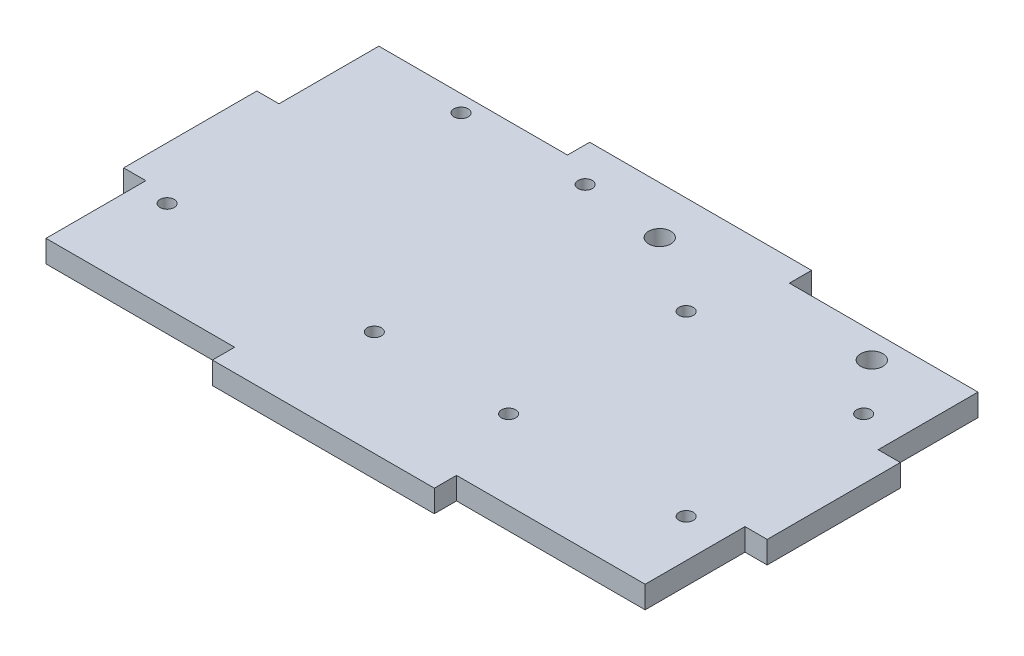
ISO-10303-21;
HEADER;
FILE_DESCRIPTION(('STEP AP214'),'2;1');
FILE_NAME('part.step','',(''),(''),'','','');
FILE_SCHEMA(('AUTOMOTIVE_DESIGN { 1 0 10303 214 1 1 1 1 }'));
ENDSEC;
DATA;
#1=APPLICATION_CONTEXT('core data for automotive mechanical design processes');
#2=APPLICATION_PROTOCOL_DEFINITION('international standard','automotive_design',2000,#1);
#3=PRODUCT_CONTEXT('',#1,'mechanical');
#4=PRODUCT('Part','Part','',(#3));
#5=PRODUCT_RELATED_PRODUCT_CATEGORY('part','',(#4));
#6=PRODUCT_DEFINITION_FORMATION('','',#4);
#7=PRODUCT_DEFINITION_CONTEXT('part definition',#1,'design');
#8=PRODUCT_DEFINITION('design','',#6,#7);
#9=PRODUCT_DEFINITION_SHAPE('','',#8);
#10=(LENGTH_UNIT() NAMED_UNIT(*) SI_UNIT(.MILLI.,.METRE.));
#11=(NAMED_UNIT(*) PLANE_ANGLE_UNIT() SI_UNIT($,.RADIAN.));
#12=(NAMED_UNIT(*) SI_UNIT($,.STERADIAN.) SOLID_ANGLE_UNIT());
#13=UNCERTAINTY_MEASURE_WITH_UNIT(LENGTH_MEASURE(1.E-05),#10,'distance_accuracy_value','');
#14=(GEOMETRIC_REPRESENTATION_CONTEXT(3) GLOBAL_UNCERTAINTY_ASSIGNED_CONTEXT((#13)) GLOBAL_UNIT_ASSIGNED_CONTEXT((#10,
#11,#12)) REPRESENTATION_CONTEXT('',''));
#15=CARTESIAN_POINT('',(0.,0.,0.));
#16=DIRECTION('',(0.,0.,1.));
#17=DIRECTION('',(1.,0.,0.));
#18=AXIS2_PLACEMENT_3D('',#15,#16,#17);
#19=CARTESIAN_POINT('',(72.5,5.,42.5));
#20=DIRECTION('',(-1.,0.,0.));
#21=DIRECTION('',(0.,0.,1.));
#22=AXIS2_PLACEMENT_3D('',#19,#20,#21);
#23=PLANE('',#22);
#24=DIRECTION('',(0.,0.,-1.));
#25=VECTOR('',#24,1.);
#26=CARTESIAN_POINT('',(72.5,0.,42.5));
#27=LINE('',#26,#25);
#28=CARTESIAN_POINT('',(72.5,0.,15.));
#29=VERTEX_POINT('',#28);
#30=CARTESIAN_POINT('',(72.5,0.,-15.));
#31=VERTEX_POINT('',#30);
#32=EDGE_CURVE('E234',#29,#31,#27,.T.);
#33=ORIENTED_EDGE('',*,*,#32,.T.);
#34=DIRECTION('',(0.,1.,0.));
#35=VECTOR('',#34,1.);
#36=CARTESIAN_POINT('',(72.5,0.,-15.));
#37=LINE('',#36,#35);
#38=CARTESIAN_POINT('',(72.5,5.,-15.));
#39=VERTEX_POINT('',#38);
#40=EDGE_CURVE('E291',#31,#39,#37,.T.);
#41=ORIENTED_EDGE('',*,*,#40,.T.);
#42=DIRECTION('',(0.,0.,-1.));
#43=VECTOR('',#42,1.);
#44=CARTESIAN_POINT('',(72.5,5.,42.5));
#45=LINE('',#44,#43);
#46=CARTESIAN_POINT('',(72.5,5.,15.));
#47=VERTEX_POINT('',#46);
#48=EDGE_CURVE('E233',#47,#39,#45,.T.);
#49=ORIENTED_EDGE('',*,*,#48,.F.);
#50=DIRECTION('',(0.,1.,0.));
#51=VECTOR('',#50,1.);
#52=CARTESIAN_POINT('',(72.5,0.,15.));
#53=LINE('',#52,#51);
#54=EDGE_CURVE('E328',#29,#47,#53,.T.);
#55=ORIENTED_EDGE('',*,*,#54,.F.);
#56=EDGE_LOOP('',(#33,#41,#49,#55));
#57=FACE_BOUND('',#56,.T.);
#58=ADVANCED_FACE('F39',(#57),#23,.F.);
#59=CARTESIAN_POINT('',(-72.5,5.,42.5));
#60=DIRECTION('',(1.,0.,0.));
#61=DIRECTION('',(0.,0.,-1.));
#62=AXIS2_PLACEMENT_3D('',#59,#60,#61);
#63=PLANE('',#62);
#64=DIRECTION('',(0.,0.,1.));
#65=VECTOR('',#64,1.);
#66=CARTESIAN_POINT('',(-72.5,0.,42.5));
#67=LINE('',#66,#65);
#68=CARTESIAN_POINT('',(-72.5,0.,-15.));
#69=VERTEX_POINT('',#68);
#70=CARTESIAN_POINT('',(-72.5,0.,15.));
#71=VERTEX_POINT('',#70);
#72=EDGE_CURVE('E246',#69,#71,#67,.T.);
#73=ORIENTED_EDGE('',*,*,#72,.T.);
#74=DIRECTION('',(0.,1.,0.));
#75=VECTOR('',#74,1.);
#76=CARTESIAN_POINT('',(-72.5,0.,15.));
#77=LINE('',#76,#75);
#78=CARTESIAN_POINT('',(-72.5,5.,15.));
#79=VERTEX_POINT('',#78);
#80=EDGE_CURVE('E189',#71,#79,#77,.T.);
#81=ORIENTED_EDGE('',*,*,#80,.T.);
#82=DIRECTION('',(0.,0.,1.));
#83=VECTOR('',#82,1.);
#84=CARTESIAN_POINT('',(-72.5,5.,42.5));
#85=LINE('',#84,#83);
#86=CARTESIAN_POINT('',(-72.5,5.,-15.));
#87=VERTEX_POINT('',#86);
#88=EDGE_CURVE('E50',#87,#79,#85,.T.);
#89=ORIENTED_EDGE('',*,*,#88,.F.);
#90=DIRECTION('',(0.,1.,0.));
#91=VECTOR('',#90,1.);
#92=CARTESIAN_POINT('',(-72.5,0.,-15.));
#93=LINE('',#92,#91);
#94=EDGE_CURVE('E363',#69,#87,#93,.T.);
#95=ORIENTED_EDGE('',*,*,#94,.F.);
#96=EDGE_LOOP('',(#73,#81,#89,#95));
#97=FACE_BOUND('',#96,.T.);
#98=ADVANCED_FACE('F456',(#97),#63,.F.);
#99=CARTESIAN_POINT('',(0.,5.,0.));
#100=DIRECTION('',(0.,-1.,0.));
#101=DIRECTION('',(0.,0.,-1.));
#102=AXIS2_PLACEMENT_3D('',#99,#100,#101);
#103=PLANE('',#102);
#104=CARTESIAN_POINT('',(49.29,5.,-31.79));
#105=DIRECTION('',(0.,1.,0.));
#106=DIRECTION('',(0.,0.,1.));
#107=AXIS2_PLACEMENT_3D('',#104,#105,#106);
#108=CIRCLE('',#107,2.5);
#109=CARTESIAN_POINT('',(49.29,5.,-29.29));
#110=VERTEX_POINT('',#109);
#111=EDGE_CURVE('E251',#110,#110,#108,.T.);
#112=ORIENTED_EDGE('',*,*,#111,.F.);
#113=EDGE_LOOP('',(#112));
#114=FACE_BOUND('',#113,.T.);
#115=CARTESIAN_POINT('',(1.49999999999999,5.,-31.79));
#116=DIRECTION('',(0.,1.,0.));
#117=DIRECTION('',(0.,0.,1.));
#118=AXIS2_PLACEMENT_3D('',#115,#116,#117);
#119=CIRCLE('',#118,2.5);
#120=CARTESIAN_POINT('',(1.49999999999999,5.,-29.29));
#121=VERTEX_POINT('',#120);
#122=EDGE_CURVE('E259',#121,#121,#119,.T.);
#123=ORIENTED_EDGE('',*,*,#122,.F.);
#124=EDGE_LOOP('',(#123));
#125=FACE_BOUND('',#124,.T.);
#126=CARTESIAN_POINT('',(58.87,5.,19.63));
#127=DIRECTION('',(0.,1.,0.));
#128=DIRECTION('',(0.,0.,1.));
#129=AXIS2_PLACEMENT_3D('',#126,#127,#128);
#130=CIRCLE('',#129,1.6);
#131=CARTESIAN_POINT('',(58.87,5.,21.23));
#132=VERTEX_POINT('',#131);
#133=EDGE_CURVE('E276',#132,#132,#130,.T.);
#134=ORIENTED_EDGE('',*,*,#133,.F.);
#135=EDGE_LOOP('',(#134));
#136=FACE_BOUND('',#135,.T.);
#137=CARTESIAN_POINT('',(18.87,5.,19.63));
#138=DIRECTION('',(0.,1.,0.));
#139=DIRECTION('',(0.,0.,1.));
#140=AXIS2_PLACEMENT_3D('',#137,#138,#139);
#141=CIRCLE('',#140,1.6);
#142=CARTESIAN_POINT('',(18.87,5.,21.23));
#143=VERTEX_POINT('',#142);
#144=EDGE_CURVE('E272',#143,#143,#141,.T.);
#145=ORIENTED_EDGE('',*,*,#144,.F.);
#146=EDGE_LOOP('',(#145));
#147=FACE_BOUND('',#146,.T.);
#148=CARTESIAN_POINT('',(18.87,5.,-20.37));
#149=DIRECTION('',(0.,1.,0.));
#150=DIRECTION('',(0.,0.,1.));
#151=AXIS2_PLACEMENT_3D('',#148,#149,#150);
#152=CIRCLE('',#151,1.6);
#153=CARTESIAN_POINT('',(18.87,5.,-18.77));
#154=VERTEX_POINT('',#153);
#155=EDGE_CURVE('E266',#154,#154,#152,.T.);
#156=ORIENTED_EDGE('',*,*,#155,.F.);
#157=EDGE_LOOP('',(#156));
#158=FACE_BOUND('',#157,.T.);
#159=CARTESIAN_POINT('',(58.87,5.,-20.37));
#160=DIRECTION('',(0.,1.,0.));
#161=DIRECTION('',(0.,0.,1.));
#162=AXIS2_PLACEMENT_3D('',#159,#160,#161);
#163=CIRCLE('',#162,1.6);
#164=CARTESIAN_POINT('',(58.87,5.,-18.77));
#165=VERTEX_POINT('',#164);
#166=EDGE_CURVE('E267',#165,#165,#163,.T.);
#167=ORIENTED_EDGE('',*,*,#166,.F.);
#168=EDGE_LOOP('',(#167));
#169=FACE_BOUND('',#168,.T.);
#170=CARTESIAN_POINT('',(-12.26,5.,18.77));
#171=DIRECTION('',(0.,1.,0.));
#172=DIRECTION('',(0.,0.,1.));
#173=AXIS2_PLACEMENT_3D('',#170,#171,#172);
#174=CIRCLE('',#173,1.6);
#175=CARTESIAN_POINT('',(-12.26,5.,20.37));
#176=VERTEX_POINT('',#175);
#177=EDGE_CURVE('E294',#176,#176,#174,.T.);
#178=ORIENTED_EDGE('',*,*,#177,.F.);
#179=EDGE_LOOP('',(#178));
#180=FACE_BOUND('',#179,.T.);
#181=CARTESIAN_POINT('',(-60.66,5.,17.06));
#182=DIRECTION('',(0.,1.,0.));
#183=DIRECTION('',(0.,0.,1.));
#184=AXIS2_PLACEMENT_3D('',#181,#182,#183);
#185=CIRCLE('',#184,1.6);
#186=CARTESIAN_POINT('',(-60.66,5.,18.66));
#187=VERTEX_POINT('',#186);
#188=EDGE_CURVE('E299',#187,#187,#185,.T.);
#189=ORIENTED_EDGE('',*,*,#188,.F.);
#190=EDGE_LOOP('',(#189));
#191=FACE_BOUND('',#190,.T.);
#192=CARTESIAN_POINT('',(-45.22,5.,-33.75));
#193=DIRECTION('',(0.,1.,0.));
#194=DIRECTION('',(0.,0.,1.));
#195=AXIS2_PLACEMENT_3D('',#192,#193,#194);
#196=CIRCLE('',#195,1.6);
#197=CARTESIAN_POINT('',(-45.22,5.,-32.15));
#198=VERTEX_POINT('',#197);
#199=EDGE_CURVE('E305',#198,#198,#196,.T.);
#200=ORIENTED_EDGE('',*,*,#199,.F.);
#201=EDGE_LOOP('',(#200));
#202=FACE_BOUND('',#201,.T.);
#203=CARTESIAN_POINT('',(-17.26,5.,-33.75));
#204=DIRECTION('',(0.,1.,0.));
#205=DIRECTION('',(0.,0.,1.));
#206=AXIS2_PLACEMENT_3D('',#203,#204,#205);
#207=CIRCLE('',#206,1.6);
#208=CARTESIAN_POINT('',(-17.26,5.,-32.15));
#209=VERTEX_POINT('',#208);
#210=EDGE_CURVE('E310',#209,#209,#207,.T.);
#211=ORIENTED_EDGE('',*,*,#210,.F.);
#212=EDGE_LOOP('',(#211));
#213=FACE_BOUND('',#212,.T.);
#214=DIRECTION('',(0.,0.,1.));
#215=VECTOR('',#214,1.);
#216=CARTESIAN_POINT('',(67.5,5.,-37.5));
#217=LINE('',#216,#215);
#218=CARTESIAN_POINT('',(67.5,5.,-37.5));
#219=VERTEX_POINT('',#218);
#220=CARTESIAN_POINT('',(67.5,5.,-15.));
#221=VERTEX_POINT('',#220);
#222=EDGE_CURVE('E332',#219,#221,#217,.T.);
#223=ORIENTED_EDGE('',*,*,#222,.F.);
#224=DIRECTION('',(1.,0.,0.));
#225=VECTOR('',#224,1.);
#226=CARTESIAN_POINT('',(25.,5.,-37.5));
#227=LINE('',#226,#225);
#228=CARTESIAN_POINT('',(25.,5.,-37.5));
#229=VERTEX_POINT('',#228);
#230=EDGE_CURVE('E228',#229,#219,#227,.T.);
#231=ORIENTED_EDGE('',*,*,#230,.F.);
#232=DIRECTION('',(0.,0.,1.));
#233=VECTOR('',#232,1.);
#234=CARTESIAN_POINT('',(25.,5.,-42.5));
#235=LINE('',#234,#233);
#236=CARTESIAN_POINT('',(25.,5.,-42.5));
#237=VERTEX_POINT('',#236);
#238=EDGE_CURVE('E376',#237,#229,#235,.T.);
#239=ORIENTED_EDGE('',*,*,#238,.F.);
#240=DIRECTION('',(-1.,0.,0.));
#241=VECTOR('',#240,1.);
#242=CARTESIAN_POINT('',(-72.5,5.,-42.5));
#243=LINE('',#242,#241);
#244=CARTESIAN_POINT('',(-25.,5.,-42.5));
#245=VERTEX_POINT('',#244);
#246=EDGE_CURVE('E240',#237,#245,#243,.T.);
#247=ORIENTED_EDGE('',*,*,#246,.T.);
#248=DIRECTION('',(0.,0.,-1.));
#249=VECTOR('',#248,1.);
#250=CARTESIAN_POINT('',(-25.,5.,-42.5));
#251=LINE('',#250,#249);
#252=CARTESIAN_POINT('',(-25.,5.,-37.5));
#253=VERTEX_POINT('',#252);
#254=EDGE_CURVE('E219',#253,#245,#251,.T.);
#255=ORIENTED_EDGE('',*,*,#254,.F.);
#256=DIRECTION('',(1.,0.,0.));
#257=VECTOR('',#256,1.);
#258=CARTESIAN_POINT('',(-72.5,5.,-37.5));
#259=LINE('',#258,#257);
#260=CARTESIAN_POINT('',(-67.5,5.,-37.5));
#261=VERTEX_POINT('',#260);
#262=EDGE_CURVE('E221',#261,#253,#259,.T.);
#263=ORIENTED_EDGE('',*,*,#262,.F.);
#264=DIRECTION('',(0.,0.,-1.));
#265=VECTOR('',#264,1.);
#266=CARTESIAN_POINT('',(-67.5,5.,-37.5));
#267=LINE('',#266,#265);
#268=CARTESIAN_POINT('',(-67.5,5.,-15.));
#269=VERTEX_POINT('',#268);
#270=EDGE_CURVE('E54',#269,#261,#267,.T.);
#271=ORIENTED_EDGE('',*,*,#270,.F.);
#272=DIRECTION('',(1.,0.,0.));
#273=VECTOR('',#272,1.);
#274=CARTESIAN_POINT('',(-67.5,5.,-15.));
#275=LINE('',#274,#273);
#276=EDGE_CURVE('E196',#87,#269,#275,.T.);
#277=ORIENTED_EDGE('',*,*,#276,.F.);
#278=ORIENTED_EDGE('',*,*,#88,.T.);
#279=DIRECTION('',(-1.,0.,0.));
#280=VECTOR('',#279,1.);
#281=CARTESIAN_POINT('',(-67.5,5.,15.));
#282=LINE('',#281,#280);
#283=CARTESIAN_POINT('',(-67.5,5.,15.));
#284=VERTEX_POINT('',#283);
#285=EDGE_CURVE('E197',#284,#79,#282,.T.);
#286=ORIENTED_EDGE('',*,*,#285,.F.);
#287=DIRECTION('',(0.,0.,-1.));
#288=VECTOR('',#287,1.);
#289=CARTESIAN_POINT('',(-67.5,5.,15.));
#290=LINE('',#289,#288);
#291=CARTESIAN_POINT('',(-67.5,5.,37.5));
#292=VERTEX_POINT('',#291);
#293=EDGE_CURVE('E177',#292,#284,#290,.T.);
#294=ORIENTED_EDGE('',*,*,#293,.F.);
#295=DIRECTION('',(-1.,0.,0.));
#296=VECTOR('',#295,1.);
#297=CARTESIAN_POINT('',(-72.5,5.,37.5));
#298=LINE('',#297,#296);
#299=CARTESIAN_POINT('',(-25.,5.,37.5));
#300=VERTEX_POINT('',#299);
#301=EDGE_CURVE('E192',#300,#292,#298,.T.);
#302=ORIENTED_EDGE('',*,*,#301,.F.);
#303=DIRECTION('',(0.,0.,-1.));
#304=VECTOR('',#303,1.);
#305=CARTESIAN_POINT('',(-25.,5.,42.5));
#306=LINE('',#305,#304);
#307=CARTESIAN_POINT('',(-25.,5.,42.5));
#308=VERTEX_POINT('',#307);
#309=EDGE_CURVE('E204',#308,#300,#306,.T.);
#310=ORIENTED_EDGE('',*,*,#309,.F.);
#311=DIRECTION('',(1.,0.,0.));
#312=VECTOR('',#311,1.);
#313=CARTESIAN_POINT('',(-72.5,5.,42.5));
#314=LINE('',#313,#312);
#315=CARTESIAN_POINT('',(25.,5.,42.5));
#316=VERTEX_POINT('',#315);
#317=EDGE_CURVE('E11',#308,#316,#314,.T.);
#318=ORIENTED_EDGE('',*,*,#317,.T.);
#319=DIRECTION('',(0.,0.,1.));
#320=VECTOR('',#319,1.);
#321=CARTESIAN_POINT('',(25.,5.,42.5));
#322=LINE('',#321,#320);
#323=CARTESIAN_POINT('',(25.,5.,37.5));
#324=VERTEX_POINT('',#323);
#325=EDGE_CURVE('E374',#324,#316,#322,.T.);
#326=ORIENTED_EDGE('',*,*,#325,.F.);
#327=DIRECTION('',(-1.,0.,0.));
#328=VECTOR('',#327,1.);
#329=CARTESIAN_POINT('',(25.,5.,37.5));
#330=LINE('',#329,#328);
#331=CARTESIAN_POINT('',(67.5,5.,37.5));
#332=VERTEX_POINT('',#331);
#333=EDGE_CURVE('E394',#332,#324,#330,.T.);
#334=ORIENTED_EDGE('',*,*,#333,.F.);
#335=DIRECTION('',(0.,0.,1.));
#336=VECTOR('',#335,1.);
#337=CARTESIAN_POINT('',(67.5,5.,15.));
#338=LINE('',#337,#336);
#339=CARTESIAN_POINT('',(67.5,5.,15.));
#340=VERTEX_POINT('',#339);
#341=EDGE_CURVE('E335',#340,#332,#338,.T.);
#342=ORIENTED_EDGE('',*,*,#341,.F.);
#343=DIRECTION('',(-1.,0.,0.));
#344=VECTOR('',#343,1.);
#345=CARTESIAN_POINT('',(67.5,5.,15.));
#346=LINE('',#345,#344);
#347=EDGE_CURVE('E187',#47,#340,#346,.T.);
#348=ORIENTED_EDGE('',*,*,#347,.F.);
#349=ORIENTED_EDGE('',*,*,#48,.T.);
#350=DIRECTION('',(1.,0.,0.));
#351=VECTOR('',#350,1.);
#352=CARTESIAN_POINT('',(67.5,5.,-15.));
#353=LINE('',#352,#351);
#354=EDGE_CURVE('E346',#221,#39,#353,.T.);
#355=ORIENTED_EDGE('',*,*,#354,.F.);
#356=EDGE_LOOP('',(#223,#231,#239,#247,#255,#263,#271,#277,#278,#286,#294,#302,#310,#318,#326,
#334,#342,#348,#349,#355));
#357=FACE_BOUND('',#356,.T.);
#358=ADVANCED_FACE('F195',(#114,#125,#136,#147,#158,#169,#180,#191,#202,#213,#357),#103,.F.);
#359=CARTESIAN_POINT('',(0.,0.,0.));
#360=DIRECTION('',(0.,-1.,0.));
#361=DIRECTION('',(0.,0.,-1.));
#362=AXIS2_PLACEMENT_3D('',#359,#360,#361);
#363=PLANE('',#362);
#364=CARTESIAN_POINT('',(49.29,0.,-31.79));
#365=DIRECTION('',(0.,-1.,0.));
#366=DIRECTION('',(0.,0.,-1.));
#367=AXIS2_PLACEMENT_3D('',#364,#365,#366);
#368=CIRCLE('',#367,2.5);
#369=CARTESIAN_POINT('',(49.29,0.,-34.29));
#370=VERTEX_POINT('',#369);
#371=EDGE_CURVE('E45',#370,#370,#368,.T.);
#372=ORIENTED_EDGE('',*,*,#371,.F.);
#373=EDGE_LOOP('',(#372));
#374=FACE_BOUND('',#373,.T.);
#375=CARTESIAN_POINT('',(1.49999999999999,0.,-31.79));
#376=DIRECTION('',(0.,-1.,0.));
#377=DIRECTION('',(0.,0.,-1.));
#378=AXIS2_PLACEMENT_3D('',#375,#376,#377);
#379=CIRCLE('',#378,2.5);
#380=CARTESIAN_POINT('',(1.49999999999999,0.,-34.29));
#381=VERTEX_POINT('',#380);
#382=EDGE_CURVE('E253',#381,#381,#379,.T.);
#383=ORIENTED_EDGE('',*,*,#382,.F.);
#384=EDGE_LOOP('',(#383));
#385=FACE_BOUND('',#384,.T.);
#386=CARTESIAN_POINT('',(58.87,0.,19.63));
#387=DIRECTION('',(0.,1.,0.));
#388=DIRECTION('',(0.,0.,1.));
#389=AXIS2_PLACEMENT_3D('',#386,#387,#388);
#390=CIRCLE('',#389,1.6);
#391=CARTESIAN_POINT('',(58.87,0.,21.23));
#392=VERTEX_POINT('',#391);
#393=EDGE_CURVE('E260',#392,#392,#390,.T.);
#394=ORIENTED_EDGE('',*,*,#393,.T.);
#395=EDGE_LOOP('',(#394));
#396=FACE_BOUND('',#395,.T.);
#397=CARTESIAN_POINT('',(18.87,0.,19.63));
#398=DIRECTION('',(0.,1.,0.));
#399=DIRECTION('',(0.,0.,1.));
#400=AXIS2_PLACEMENT_3D('',#397,#398,#399);
#401=CIRCLE('',#400,1.6);
#402=CARTESIAN_POINT('',(18.87,0.,21.23));
#403=VERTEX_POINT('',#402);
#404=EDGE_CURVE('E277',#403,#403,#401,.T.);
#405=ORIENTED_EDGE('',*,*,#404,.T.);
#406=EDGE_LOOP('',(#405));
#407=FACE_BOUND('',#406,.T.);
#408=CARTESIAN_POINT('',(18.87,0.,-20.37));
#409=DIRECTION('',(0.,1.,0.));
#410=DIRECTION('',(0.,0.,1.));
#411=AXIS2_PLACEMENT_3D('',#408,#409,#410);
#412=CIRCLE('',#411,1.6);
#413=CARTESIAN_POINT('',(18.87,0.,-18.77));
#414=VERTEX_POINT('',#413);
#415=EDGE_CURVE('E269',#414,#414,#412,.T.);
#416=ORIENTED_EDGE('',*,*,#415,.T.);
#417=EDGE_LOOP('',(#416));
#418=FACE_BOUND('',#417,.T.);
#419=CARTESIAN_POINT('',(58.87,0.,-20.37));
#420=DIRECTION('',(0.,1.,0.));
#421=DIRECTION('',(0.,0.,1.));
#422=AXIS2_PLACEMENT_3D('',#419,#420,#421);
#423=CIRCLE('',#422,1.6);
#424=CARTESIAN_POINT('',(58.87,0.,-18.77));
#425=VERTEX_POINT('',#424);
#426=EDGE_CURVE('E285',#425,#425,#423,.T.);
#427=ORIENTED_EDGE('',*,*,#426,.T.);
#428=EDGE_LOOP('',(#427));
#429=FACE_BOUND('',#428,.T.);
#430=CARTESIAN_POINT('',(-12.26,0.,18.77));
#431=DIRECTION('',(0.,1.,0.));
#432=DIRECTION('',(0.,0.,1.));
#433=AXIS2_PLACEMENT_3D('',#430,#431,#432);
#434=CIRCLE('',#433,1.6);
#435=CARTESIAN_POINT('',(-12.26,0.,20.37));
#436=VERTEX_POINT('',#435);
#437=EDGE_CURVE('E287',#436,#436,#434,.T.);
#438=ORIENTED_EDGE('',*,*,#437,.T.);
#439=EDGE_LOOP('',(#438));
#440=FACE_BOUND('',#439,.T.);
#441=CARTESIAN_POINT('',(-60.66,0.,17.06));
#442=DIRECTION('',(0.,1.,0.));
#443=DIRECTION('',(0.,0.,1.));
#444=AXIS2_PLACEMENT_3D('',#441,#442,#443);
#445=CIRCLE('',#444,1.6);
#446=CARTESIAN_POINT('',(-60.66,0.,18.66));
#447=VERTEX_POINT('',#446);
#448=EDGE_CURVE('E296',#447,#447,#445,.T.);
#449=ORIENTED_EDGE('',*,*,#448,.T.);
#450=EDGE_LOOP('',(#449));
#451=FACE_BOUND('',#450,.T.);
#452=CARTESIAN_POINT('',(-45.22,0.,-33.75));
#453=DIRECTION('',(0.,1.,0.));
#454=DIRECTION('',(0.,0.,1.));
#455=AXIS2_PLACEMENT_3D('',#452,#453,#454);
#456=CIRCLE('',#455,1.6);
#457=CARTESIAN_POINT('',(-45.22,0.,-32.15));
#458=VERTEX_POINT('',#457);
#459=EDGE_CURVE('E308',#458,#458,#456,.T.);
#460=ORIENTED_EDGE('',*,*,#459,.T.);
#461=EDGE_LOOP('',(#460));
#462=FACE_BOUND('',#461,.T.);
#463=CARTESIAN_POINT('',(-17.26,0.,-33.75));
#464=DIRECTION('',(0.,1.,0.));
#465=DIRECTION('',(0.,0.,1.));
#466=AXIS2_PLACEMENT_3D('',#463,#464,#465);
#467=CIRCLE('',#466,1.6);
#468=CARTESIAN_POINT('',(-17.26,0.,-32.15));
#469=VERTEX_POINT('',#468);
#470=EDGE_CURVE('E286',#469,#469,#467,.T.);
#471=ORIENTED_EDGE('',*,*,#470,.T.);
#472=EDGE_LOOP('',(#471));
#473=FACE_BOUND('',#472,.T.);
#474=DIRECTION('',(0.,0.,1.));
#475=VECTOR('',#474,1.);
#476=CARTESIAN_POINT('',(67.5,0.,-37.5));
#477=LINE('',#476,#475);
#478=CARTESIAN_POINT('',(67.5,0.,-37.5));
#479=VERTEX_POINT('',#478);
#480=CARTESIAN_POINT('',(67.5,0.,-15.));
#481=VERTEX_POINT('',#480);
#482=EDGE_CURVE('E62',#479,#481,#477,.T.);
#483=ORIENTED_EDGE('',*,*,#482,.T.);
#484=DIRECTION('',(1.,0.,0.));
#485=VECTOR('',#484,1.);
#486=CARTESIAN_POINT('',(67.5,0.,-15.));
#487=LINE('',#486,#485);
#488=EDGE_CURVE('E345',#481,#31,#487,.T.);
#489=ORIENTED_EDGE('',*,*,#488,.T.);
#490=ORIENTED_EDGE('',*,*,#32,.F.);
#491=DIRECTION('',(-1.,0.,0.));
#492=VECTOR('',#491,1.);
#493=CARTESIAN_POINT('',(67.5,0.,15.));
#494=LINE('',#493,#492);
#495=CARTESIAN_POINT('',(67.5,0.,15.));
#496=VERTEX_POINT('',#495);
#497=EDGE_CURVE('E331',#29,#496,#494,.T.);
#498=ORIENTED_EDGE('',*,*,#497,.T.);
#499=DIRECTION('',(0.,0.,1.));
#500=VECTOR('',#499,1.);
#501=CARTESIAN_POINT('',(67.5,0.,15.));
#502=LINE('',#501,#500);
#503=CARTESIAN_POINT('',(67.5,0.,37.5));
#504=VERTEX_POINT('',#503);
#505=EDGE_CURVE('E324',#496,#504,#502,.T.);
#506=ORIENTED_EDGE('',*,*,#505,.T.);
#507=DIRECTION('',(-1.,0.,0.));
#508=VECTOR('',#507,1.);
#509=CARTESIAN_POINT('',(25.,0.,37.5));
#510=LINE('',#509,#508);
#511=CARTESIAN_POINT('',(25.,0.,37.5));
#512=VERTEX_POINT('',#511);
#513=EDGE_CURVE('E386',#504,#512,#510,.T.);
#514=ORIENTED_EDGE('',*,*,#513,.T.);
#515=DIRECTION('',(0.,0.,1.));
#516=VECTOR('',#515,1.);
#517=CARTESIAN_POINT('',(25.,0.,42.5));
#518=LINE('',#517,#516);
#519=CARTESIAN_POINT('',(25.,0.,42.5));
#520=VERTEX_POINT('',#519);
#521=EDGE_CURVE('E395',#512,#520,#518,.T.);
#522=ORIENTED_EDGE('',*,*,#521,.T.);
#523=DIRECTION('',(1.,0.,0.));
#524=VECTOR('',#523,1.);
#525=CARTESIAN_POINT('',(-72.5,0.,42.5));
#526=LINE('',#525,#524);
#527=CARTESIAN_POINT('',(-25.,0.,42.5));
#528=VERTEX_POINT('',#527);
#529=EDGE_CURVE('E236',#528,#520,#526,.T.);
#530=ORIENTED_EDGE('',*,*,#529,.F.);
#531=DIRECTION('',(0.,0.,-1.));
#532=VECTOR('',#531,1.);
#533=CARTESIAN_POINT('',(-25.,0.,42.5));
#534=LINE('',#533,#532);
#535=CARTESIAN_POINT('',(-25.,0.,37.5));
#536=VERTEX_POINT('',#535);
#537=EDGE_CURVE('E202',#528,#536,#534,.T.);
#538=ORIENTED_EDGE('',*,*,#537,.T.);
#539=DIRECTION('',(-1.,0.,0.));
#540=VECTOR('',#539,1.);
#541=CARTESIAN_POINT('',(-72.5,0.,37.5));
#542=LINE('',#541,#540);
#543=CARTESIAN_POINT('',(-67.5,0.,37.5));
#544=VERTEX_POINT('',#543);
#545=EDGE_CURVE('E209',#536,#544,#542,.T.);
#546=ORIENTED_EDGE('',*,*,#545,.T.);
#547=DIRECTION('',(0.,0.,-1.));
#548=VECTOR('',#547,1.);
#549=CARTESIAN_POINT('',(-67.5,0.,15.));
#550=LINE('',#549,#548);
#551=CARTESIAN_POINT('',(-67.5,0.,15.));
#552=VERTEX_POINT('',#551);
#553=EDGE_CURVE('E181',#544,#552,#550,.T.);
#554=ORIENTED_EDGE('',*,*,#553,.T.);
#555=DIRECTION('',(-1.,0.,0.));
#556=VECTOR('',#555,1.);
#557=CARTESIAN_POINT('',(-67.5,0.,15.));
#558=LINE('',#557,#556);
#559=EDGE_CURVE('E316',#552,#71,#558,.T.);
#560=ORIENTED_EDGE('',*,*,#559,.T.);
#561=ORIENTED_EDGE('',*,*,#72,.F.);
#562=DIRECTION('',(1.,0.,0.));
#563=VECTOR('',#562,1.);
#564=CARTESIAN_POINT('',(-67.5,0.,-15.));
#565=LINE('',#564,#563);
#566=CARTESIAN_POINT('',(-67.5,0.,-15.));
#567=VERTEX_POINT('',#566);
#568=EDGE_CURVE('E351',#69,#567,#565,.T.);
#569=ORIENTED_EDGE('',*,*,#568,.T.);
#570=DIRECTION('',(0.,0.,-1.));
#571=VECTOR('',#570,1.);
#572=CARTESIAN_POINT('',(-67.5,0.,-37.5));
#573=LINE('',#572,#571);
#574=CARTESIAN_POINT('',(-67.5,0.,-37.5));
#575=VERTEX_POINT('',#574);
#576=EDGE_CURVE('E360',#567,#575,#573,.T.);
#577=ORIENTED_EDGE('',*,*,#576,.T.);
#578=DIRECTION('',(1.,0.,0.));
#579=VECTOR('',#578,1.);
#580=CARTESIAN_POINT('',(-72.5,0.,-37.5));
#581=LINE('',#580,#579);
#582=CARTESIAN_POINT('',(-25.,0.,-37.5));
#583=VERTEX_POINT('',#582);
#584=EDGE_CURVE('E220',#575,#583,#581,.T.);
#585=ORIENTED_EDGE('',*,*,#584,.T.);
#586=DIRECTION('',(0.,0.,-1.));
#587=VECTOR('',#586,1.);
#588=CARTESIAN_POINT('',(-25.,0.,-42.5));
#589=LINE('',#588,#587);
#590=CARTESIAN_POINT('',(-25.,0.,-42.5));
#591=VERTEX_POINT('',#590);
#592=EDGE_CURVE('E218',#583,#591,#589,.T.);
#593=ORIENTED_EDGE('',*,*,#592,.T.);
#594=DIRECTION('',(-1.,0.,0.));
#595=VECTOR('',#594,1.);
#596=CARTESIAN_POINT('',(-72.5,0.,-42.5));
#597=LINE('',#596,#595);
#598=CARTESIAN_POINT('',(25.,0.,-42.5));
#599=VERTEX_POINT('',#598);
#600=EDGE_CURVE('E245',#599,#591,#597,.T.);
#601=ORIENTED_EDGE('',*,*,#600,.F.);
#602=DIRECTION('',(0.,0.,1.));
#603=VECTOR('',#602,1.);
#604=CARTESIAN_POINT('',(25.,0.,-42.5));
#605=LINE('',#604,#603);
#606=CARTESIAN_POINT('',(25.,0.,-37.5));
#607=VERTEX_POINT('',#606);
#608=EDGE_CURVE('E375',#599,#607,#605,.T.);
#609=ORIENTED_EDGE('',*,*,#608,.T.);
#610=DIRECTION('',(1.,0.,0.));
#611=VECTOR('',#610,1.);
#612=CARTESIAN_POINT('',(25.,0.,-37.5));
#613=LINE('',#612,#611);
#614=EDGE_CURVE('E377',#607,#479,#613,.T.);
#615=ORIENTED_EDGE('',*,*,#614,.T.);
#616=EDGE_LOOP('',(#483,#489,#490,#498,#506,#514,#522,#530,#538,#546,#554,#560,#561,#569,#577,
#585,#593,#601,#609,#615));
#617=FACE_BOUND('',#616,.T.);
#618=ADVANCED_FACE('F414',(#374,#385,#396,#407,#418,#429,#440,#451,#462,#473,#617),#363,.T.);
#619=CARTESIAN_POINT('',(25.,0.,-37.5));
#620=DIRECTION('',(0.,0.,1.));
#621=DIRECTION('',(1.,0.,0.));
#622=AXIS2_PLACEMENT_3D('',#619,#620,#621);
#623=PLANE('',#622);
#624=DIRECTION('',(0.,1.,0.));
#625=VECTOR('',#624,1.);
#626=CARTESIAN_POINT('',(67.5,0.,-37.5));
#627=LINE('',#626,#625);
#628=EDGE_CURVE('E344',#479,#219,#627,.T.);
#629=ORIENTED_EDGE('',*,*,#628,.F.);
#630=ORIENTED_EDGE('',*,*,#614,.F.);
#631=DIRECTION('',(0.,1.,0.));
#632=VECTOR('',#631,1.);
#633=CARTESIAN_POINT('',(25.,0.,-37.5));
#634=LINE('',#633,#632);
#635=EDGE_CURVE('E373',#607,#229,#634,.T.);
#636=ORIENTED_EDGE('',*,*,#635,.T.);
#637=ORIENTED_EDGE('',*,*,#230,.T.);
#638=EDGE_LOOP('',(#629,#630,#636,#637));
#639=FACE_BOUND('',#638,.T.);
#640=ADVANCED_FACE('F432',(#639),#623,.F.);
#641=CARTESIAN_POINT('',(-72.5,0.,37.5));
#642=DIRECTION('',(0.,0.,-1.));
#643=DIRECTION('',(-1.,0.,0.));
#644=AXIS2_PLACEMENT_3D('',#641,#642,#643);
#645=PLANE('',#644);
#646=DIRECTION('',(0.,1.,0.));
#647=VECTOR('',#646,1.);
#648=CARTESIAN_POINT('',(-67.5,0.,37.5));
#649=LINE('',#648,#647);
#650=EDGE_CURVE('E176',#544,#292,#649,.T.);
#651=ORIENTED_EDGE('',*,*,#650,.F.);
#652=ORIENTED_EDGE('',*,*,#545,.F.);
#653=DIRECTION('',(0.,1.,0.));
#654=VECTOR('',#653,1.);
#655=CARTESIAN_POINT('',(-25.,0.,37.5));
#656=LINE('',#655,#654);
#657=EDGE_CURVE('E205',#536,#300,#656,.T.);
#658=ORIENTED_EDGE('',*,*,#657,.T.);
#659=ORIENTED_EDGE('',*,*,#301,.T.);
#660=EDGE_LOOP('',(#651,#652,#658,#659));
#661=FACE_BOUND('',#660,.T.);
#662=ADVANCED_FACE('F199',(#661),#645,.F.);
#663=CARTESIAN_POINT('',(-72.5,5.,-42.5));
#664=DIRECTION('',(0.,0.,1.));
#665=DIRECTION('',(1.,0.,0.));
#666=AXIS2_PLACEMENT_3D('',#663,#664,#665);
#667=PLANE('',#666);
#668=DIRECTION('',(0.,1.,0.));
#669=VECTOR('',#668,1.);
#670=CARTESIAN_POINT('',(25.,0.,-42.5));
#671=LINE('',#670,#669);
#672=EDGE_CURVE('E367',#599,#237,#671,.T.);
#673=ORIENTED_EDGE('',*,*,#672,.F.);
#674=ORIENTED_EDGE('',*,*,#600,.T.);
#675=DIRECTION('',(0.,1.,0.));
#676=VECTOR('',#675,1.);
#677=CARTESIAN_POINT('',(-25.,0.,-42.5));
#678=LINE('',#677,#676);
#679=EDGE_CURVE('E227',#591,#245,#678,.T.);
#680=ORIENTED_EDGE('',*,*,#679,.T.);
#681=ORIENTED_EDGE('',*,*,#246,.F.);
#682=EDGE_LOOP('',(#673,#674,#680,#681));
#683=FACE_BOUND('',#682,.T.);
#684=ADVANCED_FACE('F445',(#683),#667,.F.);
#685=CARTESIAN_POINT('',(-72.5,5.,42.5));
#686=DIRECTION('',(0.,0.,-1.));
#687=DIRECTION('',(-1.,0.,0.));
#688=AXIS2_PLACEMENT_3D('',#685,#686,#687);
#689=PLANE('',#688);
#690=DIRECTION('',(0.,1.,0.));
#691=VECTOR('',#690,1.);
#692=CARTESIAN_POINT('',(-25.,0.,42.5));
#693=LINE('',#692,#691);
#694=EDGE_CURVE('E214',#528,#308,#693,.T.);
#695=ORIENTED_EDGE('',*,*,#694,.F.);
#696=ORIENTED_EDGE('',*,*,#529,.T.);
#697=DIRECTION('',(0.,1.,0.));
#698=VECTOR('',#697,1.);
#699=CARTESIAN_POINT('',(25.,0.,42.5));
#700=LINE('',#699,#698);
#701=EDGE_CURVE('E387',#520,#316,#700,.T.);
#702=ORIENTED_EDGE('',*,*,#701,.T.);
#703=ORIENTED_EDGE('',*,*,#317,.F.);
#704=EDGE_LOOP('',(#695,#696,#702,#703));
#705=FACE_BOUND('',#704,.T.);
#706=ADVANCED_FACE('F403',(#705),#689,.F.);
#707=CARTESIAN_POINT('',(-25.,0.,-42.5));
#708=DIRECTION('',(1.,0.,0.));
#709=DIRECTION('',(0.,0.,-1.));
#710=AXIS2_PLACEMENT_3D('',#707,#708,#709);
#711=PLANE('',#710);
#712=ORIENTED_EDGE('',*,*,#254,.T.);
#713=ORIENTED_EDGE('',*,*,#679,.F.);
#714=ORIENTED_EDGE('',*,*,#592,.F.);
#715=DIRECTION('',(0.,1.,0.));
#716=VECTOR('',#715,1.);
#717=CARTESIAN_POINT('',(-25.,0.,-37.5));
#718=LINE('',#717,#716);
#719=EDGE_CURVE('E224',#583,#253,#718,.T.);
#720=ORIENTED_EDGE('',*,*,#719,.T.);
#721=EDGE_LOOP('',(#712,#713,#714,#720));
#722=FACE_BOUND('',#721,.T.);
#723=ADVANCED_FACE('F448',(#722),#711,.F.);
#724=CARTESIAN_POINT('',(-72.5,0.,-37.5));
#725=DIRECTION('',(0.,0.,1.));
#726=DIRECTION('',(1.,0.,0.));
#727=AXIS2_PLACEMENT_3D('',#724,#725,#726);
#728=PLANE('',#727);
#729=ORIENTED_EDGE('',*,*,#584,.F.);
#730=DIRECTION('',(0.,1.,0.));
#731=VECTOR('',#730,1.);
#732=CARTESIAN_POINT('',(-67.5,0.,-37.5));
#733=LINE('',#732,#731);
#734=EDGE_CURVE('E364',#575,#261,#733,.T.);
#735=ORIENTED_EDGE('',*,*,#734,.T.);
#736=ORIENTED_EDGE('',*,*,#262,.T.);
#737=ORIENTED_EDGE('',*,*,#719,.F.);
#738=EDGE_LOOP('',(#729,#735,#736,#737));
#739=FACE_BOUND('',#738,.T.);
#740=ADVANCED_FACE('F454',(#739),#728,.F.);
#741=CARTESIAN_POINT('',(25.,0.,-42.5));
#742=DIRECTION('',(-1.,0.,0.));
#743=DIRECTION('',(0.,0.,1.));
#744=AXIS2_PLACEMENT_3D('',#741,#742,#743);
#745=PLANE('',#744);
#746=ORIENTED_EDGE('',*,*,#238,.T.);
#747=ORIENTED_EDGE('',*,*,#635,.F.);
#748=ORIENTED_EDGE('',*,*,#608,.F.);
#749=ORIENTED_EDGE('',*,*,#672,.T.);
#750=EDGE_LOOP('',(#746,#747,#748,#749));
#751=FACE_BOUND('',#750,.T.);
#752=ADVANCED_FACE('F440',(#751),#745,.F.);
#753=CARTESIAN_POINT('',(25.,0.,42.5));
#754=DIRECTION('',(-1.,0.,0.));
#755=DIRECTION('',(0.,0.,1.));
#756=AXIS2_PLACEMENT_3D('',#753,#754,#755);
#757=PLANE('',#756);
#758=ORIENTED_EDGE('',*,*,#325,.T.);
#759=ORIENTED_EDGE('',*,*,#701,.F.);
#760=ORIENTED_EDGE('',*,*,#521,.F.);
#761=DIRECTION('',(0.,1.,0.));
#762=VECTOR('',#761,1.);
#763=CARTESIAN_POINT('',(25.,0.,37.5));
#764=LINE('',#763,#762);
#765=EDGE_CURVE('E210',#512,#324,#764,.T.);
#766=ORIENTED_EDGE('',*,*,#765,.T.);
#767=EDGE_LOOP('',(#758,#759,#760,#766));
#768=FACE_BOUND('',#767,.T.);
#769=ADVANCED_FACE('F407',(#768),#757,.F.);
#770=CARTESIAN_POINT('',(25.,0.,37.5));
#771=DIRECTION('',(0.,0.,-1.));
#772=DIRECTION('',(-1.,0.,0.));
#773=AXIS2_PLACEMENT_3D('',#770,#771,#772);
#774=PLANE('',#773);
#775=ORIENTED_EDGE('',*,*,#513,.F.);
#776=DIRECTION('',(0.,1.,0.));
#777=VECTOR('',#776,1.);
#778=CARTESIAN_POINT('',(67.5,0.,37.5));
#779=LINE('',#778,#777);
#780=EDGE_CURVE('E326',#504,#332,#779,.T.);
#781=ORIENTED_EDGE('',*,*,#780,.T.);
#782=ORIENTED_EDGE('',*,*,#333,.T.);
#783=ORIENTED_EDGE('',*,*,#765,.F.);
#784=EDGE_LOOP('',(#775,#781,#782,#783));
#785=FACE_BOUND('',#784,.T.);
#786=ADVANCED_FACE('F412',(#785),#774,.F.);
#787=CARTESIAN_POINT('',(-25.,0.,42.5));
#788=DIRECTION('',(1.,0.,0.));
#789=DIRECTION('',(0.,0.,-1.));
#790=AXIS2_PLACEMENT_3D('',#787,#788,#789);
#791=PLANE('',#790);
#792=ORIENTED_EDGE('',*,*,#309,.T.);
#793=ORIENTED_EDGE('',*,*,#657,.F.);
#794=ORIENTED_EDGE('',*,*,#537,.F.);
#795=ORIENTED_EDGE('',*,*,#694,.T.);
#796=EDGE_LOOP('',(#792,#793,#794,#795));
#797=FACE_BOUND('',#796,.T.);
#798=ADVANCED_FACE('F397',(#797),#791,.F.);
#799=CARTESIAN_POINT('',(-67.5,0.,15.));
#800=DIRECTION('',(1.,0.,0.));
#801=DIRECTION('',(0.,0.,-1.));
#802=AXIS2_PLACEMENT_3D('',#799,#800,#801);
#803=PLANE('',#802);
#804=ORIENTED_EDGE('',*,*,#293,.T.);
#805=DIRECTION('',(0.,1.,0.));
#806=VECTOR('',#805,1.);
#807=CARTESIAN_POINT('',(-67.5,0.,15.));
#808=LINE('',#807,#806);
#809=EDGE_CURVE('E314',#552,#284,#808,.T.);
#810=ORIENTED_EDGE('',*,*,#809,.F.);
#811=ORIENTED_EDGE('',*,*,#553,.F.);
#812=ORIENTED_EDGE('',*,*,#650,.T.);
#813=EDGE_LOOP('',(#804,#810,#811,#812));
#814=FACE_BOUND('',#813,.T.);
#815=ADVANCED_FACE('F178',(#814),#803,.F.);
#816=CARTESIAN_POINT('',(-67.5,0.,15.));
#817=DIRECTION('',(0.,0.,-1.));
#818=DIRECTION('',(-1.,0.,0.));
#819=AXIS2_PLACEMENT_3D('',#816,#817,#818);
#820=PLANE('',#819);
#821=ORIENTED_EDGE('',*,*,#285,.T.);
#822=ORIENTED_EDGE('',*,*,#80,.F.);
#823=ORIENTED_EDGE('',*,*,#559,.F.);
#824=ORIENTED_EDGE('',*,*,#809,.T.);
#825=EDGE_LOOP('',(#821,#822,#823,#824));
#826=FACE_BOUND('',#825,.T.);
#827=ADVANCED_FACE('F464',(#826),#820,.F.);
#828=CARTESIAN_POINT('',(67.5,0.,15.));
#829=DIRECTION('',(0.,0.,-1.));
#830=DIRECTION('',(-1.,0.,0.));
#831=AXIS2_PLACEMENT_3D('',#828,#829,#830);
#832=PLANE('',#831);
#833=ORIENTED_EDGE('',*,*,#347,.T.);
#834=DIRECTION('',(0.,1.,0.));
#835=VECTOR('',#834,1.);
#836=CARTESIAN_POINT('',(67.5,0.,15.));
#837=LINE('',#836,#835);
#838=EDGE_CURVE('E323',#496,#340,#837,.T.);
#839=ORIENTED_EDGE('',*,*,#838,.F.);
#840=ORIENTED_EDGE('',*,*,#497,.F.);
#841=ORIENTED_EDGE('',*,*,#54,.T.);
#842=EDGE_LOOP('',(#833,#839,#840,#841));
#843=FACE_BOUND('',#842,.T.);
#844=ADVANCED_FACE('F421',(#843),#832,.F.);
#845=CARTESIAN_POINT('',(67.5,0.,15.));
#846=DIRECTION('',(-1.,0.,0.));
#847=DIRECTION('',(0.,0.,1.));
#848=AXIS2_PLACEMENT_3D('',#845,#846,#847);
#849=PLANE('',#848);
#850=ORIENTED_EDGE('',*,*,#341,.T.);
#851=ORIENTED_EDGE('',*,*,#780,.F.);
#852=ORIENTED_EDGE('',*,*,#505,.F.);
#853=ORIENTED_EDGE('',*,*,#838,.T.);
#854=EDGE_LOOP('',(#850,#851,#852,#853));
#855=FACE_BOUND('',#854,.T.);
#856=ADVANCED_FACE('F423',(#855),#849,.F.);
#857=CARTESIAN_POINT('',(67.5,0.,-15.));
#858=DIRECTION('',(0.,0.,1.));
#859=DIRECTION('',(1.,0.,0.));
#860=AXIS2_PLACEMENT_3D('',#857,#858,#859);
#861=PLANE('',#860);
#862=ORIENTED_EDGE('',*,*,#354,.T.);
#863=ORIENTED_EDGE('',*,*,#40,.F.);
#864=ORIENTED_EDGE('',*,*,#488,.F.);
#865=DIRECTION('',(0.,1.,0.));
#866=VECTOR('',#865,1.);
#867=CARTESIAN_POINT('',(67.5,0.,-15.));
#868=LINE('',#867,#866);
#869=EDGE_CURVE('E343',#481,#221,#868,.T.);
#870=ORIENTED_EDGE('',*,*,#869,.T.);
#871=EDGE_LOOP('',(#862,#863,#864,#870));
#872=FACE_BOUND('',#871,.T.);
#873=ADVANCED_FACE('F427',(#872),#861,.F.);
#874=CARTESIAN_POINT('',(67.5,0.,-37.5));
#875=DIRECTION('',(-1.,0.,0.));
#876=DIRECTION('',(0.,0.,1.));
#877=AXIS2_PLACEMENT_3D('',#874,#875,#876);
#878=PLANE('',#877);
#879=ORIENTED_EDGE('',*,*,#222,.T.);
#880=ORIENTED_EDGE('',*,*,#869,.F.);
#881=ORIENTED_EDGE('',*,*,#482,.F.);
#882=ORIENTED_EDGE('',*,*,#628,.T.);
#883=EDGE_LOOP('',(#879,#880,#881,#882));
#884=FACE_BOUND('',#883,.T.);
#885=ADVANCED_FACE('F469',(#884),#878,.F.);
#886=CARTESIAN_POINT('',(-67.5,0.,-37.5));
#887=DIRECTION('',(1.,0.,0.));
#888=DIRECTION('',(0.,0.,-1.));
#889=AXIS2_PLACEMENT_3D('',#886,#887,#888);
#890=PLANE('',#889);
#891=ORIENTED_EDGE('',*,*,#270,.T.);
#892=ORIENTED_EDGE('',*,*,#734,.F.);
#893=ORIENTED_EDGE('',*,*,#576,.F.);
#894=DIRECTION('',(0.,1.,0.));
#895=VECTOR('',#894,1.);
#896=CARTESIAN_POINT('',(-67.5,0.,-15.));
#897=LINE('',#896,#895);
#898=EDGE_CURVE('E370',#567,#269,#897,.T.);
#899=ORIENTED_EDGE('',*,*,#898,.T.);
#900=EDGE_LOOP('',(#891,#892,#893,#899));
#901=FACE_BOUND('',#900,.T.);
#902=ADVANCED_FACE('F465',(#901),#890,.F.);
#903=CARTESIAN_POINT('',(-67.5,0.,-15.));
#904=DIRECTION('',(0.,0.,1.));
#905=DIRECTION('',(1.,0.,0.));
#906=AXIS2_PLACEMENT_3D('',#903,#904,#905);
#907=PLANE('',#906);
#908=ORIENTED_EDGE('',*,*,#276,.T.);
#909=ORIENTED_EDGE('',*,*,#898,.F.);
#910=ORIENTED_EDGE('',*,*,#568,.F.);
#911=ORIENTED_EDGE('',*,*,#94,.T.);
#912=EDGE_LOOP('',(#908,#909,#910,#911));
#913=FACE_BOUND('',#912,.T.);
#914=ADVANCED_FACE('F462',(#913),#907,.F.);
#915=CARTESIAN_POINT('',(-17.26,0.,-33.75));
#916=DIRECTION('',(0.,1.,0.));
#917=DIRECTION('',(0.,0.,1.));
#918=AXIS2_PLACEMENT_3D('',#915,#916,#917);
#919=CYLINDRICAL_SURFACE('',#918,1.6);
#920=ORIENTED_EDGE('',*,*,#470,.F.);
#921=EDGE_LOOP('',(#920));
#922=FACE_BOUND('',#921,.T.);
#923=ORIENTED_EDGE('',*,*,#210,.T.);
#924=EDGE_LOOP('',(#923));
#925=FACE_BOUND('',#924,.T.);
#926=ADVANCED_FACE('F472',(#922,#925),#919,.F.);
#927=CARTESIAN_POINT('',(-45.22,0.,-33.75));
#928=DIRECTION('',(0.,1.,0.));
#929=DIRECTION('',(0.,0.,1.));
#930=AXIS2_PLACEMENT_3D('',#927,#928,#929);
#931=CYLINDRICAL_SURFACE('',#930,1.6);
#932=ORIENTED_EDGE('',*,*,#459,.F.);
#933=EDGE_LOOP('',(#932));
#934=FACE_BOUND('',#933,.T.);
#935=ORIENTED_EDGE('',*,*,#199,.T.);
#936=EDGE_LOOP('',(#935));
#937=FACE_BOUND('',#936,.T.);
#938=ADVANCED_FACE('F533',(#934,#937),#931,.F.);
#939=CARTESIAN_POINT('',(-60.66,0.,17.06));
#940=DIRECTION('',(0.,1.,0.));
#941=DIRECTION('',(0.,0.,1.));
#942=AXIS2_PLACEMENT_3D('',#939,#940,#941);
#943=CYLINDRICAL_SURFACE('',#942,1.6);
#944=ORIENTED_EDGE('',*,*,#448,.F.);
#945=EDGE_LOOP('',(#944));
#946=FACE_BOUND('',#945,.T.);
#947=ORIENTED_EDGE('',*,*,#188,.T.);
#948=EDGE_LOOP('',(#947));
#949=FACE_BOUND('',#948,.T.);
#950=ADVANCED_FACE('F538',(#946,#949),#943,.F.);
#951=CARTESIAN_POINT('',(-12.26,0.,18.77));
#952=DIRECTION('',(0.,1.,0.));
#953=DIRECTION('',(0.,0.,1.));
#954=AXIS2_PLACEMENT_3D('',#951,#952,#953);
#955=CYLINDRICAL_SURFACE('',#954,1.6);
#956=ORIENTED_EDGE('',*,*,#437,.F.);
#957=EDGE_LOOP('',(#956));
#958=FACE_BOUND('',#957,.T.);
#959=ORIENTED_EDGE('',*,*,#177,.T.);
#960=EDGE_LOOP('',(#959));
#961=FACE_BOUND('',#960,.T.);
#962=ADVANCED_FACE('F587',(#958,#961),#955,.F.);
#963=CARTESIAN_POINT('',(58.87,0.,-20.37));
#964=DIRECTION('',(0.,1.,0.));
#965=DIRECTION('',(0.,0.,1.));
#966=AXIS2_PLACEMENT_3D('',#963,#964,#965);
#967=CYLINDRICAL_SURFACE('',#966,1.6);
#968=ORIENTED_EDGE('',*,*,#426,.F.);
#969=EDGE_LOOP('',(#968));
#970=FACE_BOUND('',#969,.T.);
#971=ORIENTED_EDGE('',*,*,#166,.T.);
#972=EDGE_LOOP('',(#971));
#973=FACE_BOUND('',#972,.T.);
#974=ADVANCED_FACE('F597',(#970,#973),#967,.F.);
#975=CARTESIAN_POINT('',(18.87,0.,-20.37));
#976=DIRECTION('',(0.,1.,0.));
#977=DIRECTION('',(0.,0.,1.));
#978=AXIS2_PLACEMENT_3D('',#975,#976,#977);
#979=CYLINDRICAL_SURFACE('',#978,1.6);
#980=ORIENTED_EDGE('',*,*,#415,.F.);
#981=EDGE_LOOP('',(#980));
#982=FACE_BOUND('',#981,.T.);
#983=ORIENTED_EDGE('',*,*,#155,.T.);
#984=EDGE_LOOP('',(#983));
#985=FACE_BOUND('',#984,.T.);
#986=ADVANCED_FACE('F606',(#982,#985),#979,.F.);
#987=CARTESIAN_POINT('',(18.87,0.,19.63));
#988=DIRECTION('',(0.,1.,0.));
#989=DIRECTION('',(0.,0.,1.));
#990=AXIS2_PLACEMENT_3D('',#987,#988,#989);
#991=CYLINDRICAL_SURFACE('',#990,1.6);
#992=ORIENTED_EDGE('',*,*,#404,.F.);
#993=EDGE_LOOP('',(#992));
#994=FACE_BOUND('',#993,.T.);
#995=ORIENTED_EDGE('',*,*,#144,.T.);
#996=EDGE_LOOP('',(#995));
#997=FACE_BOUND('',#996,.T.);
#998=ADVANCED_FACE('F618',(#994,#997),#991,.F.);
#999=CARTESIAN_POINT('',(58.87,0.,19.63));
#1000=DIRECTION('',(0.,1.,0.));
#1001=DIRECTION('',(0.,0.,1.));
#1002=AXIS2_PLACEMENT_3D('',#999,#1000,#1001);
#1003=CYLINDRICAL_SURFACE('',#1002,1.6);
#1004=ORIENTED_EDGE('',*,*,#393,.F.);
#1005=EDGE_LOOP('',(#1004));
#1006=FACE_BOUND('',#1005,.T.);
#1007=ORIENTED_EDGE('',*,*,#133,.T.);
#1008=EDGE_LOOP('',(#1007));
#1009=FACE_BOUND('',#1008,.T.);
#1010=ADVANCED_FACE('F630',(#1006,#1009),#1003,.F.);
#1011=CARTESIAN_POINT('',(1.49999999999999,-5.,-31.79));
#1012=DIRECTION('',(0.,1.,0.));
#1013=DIRECTION('',(0.,0.,1.));
#1014=AXIS2_PLACEMENT_3D('',#1011,#1012,#1013);
#1015=CYLINDRICAL_SURFACE('',#1014,2.5);
#1016=ORIENTED_EDGE('',*,*,#382,.T.);
#1017=EDGE_LOOP('',(#1016));
#1018=FACE_BOUND('',#1017,.T.);
#1019=ORIENTED_EDGE('',*,*,#122,.T.);
#1020=EDGE_LOOP('',(#1019));
#1021=FACE_BOUND('',#1020,.T.);
#1022=ADVANCED_FACE('F640',(#1018,#1021),#1015,.F.);
#1023=CARTESIAN_POINT('',(49.29,-5.,-31.79));
#1024=DIRECTION('',(0.,1.,0.));
#1025=DIRECTION('',(0.,0.,1.));
#1026=AXIS2_PLACEMENT_3D('',#1023,#1024,#1025);
#1027=CYLINDRICAL_SURFACE('',#1026,2.5);
#1028=ORIENTED_EDGE('',*,*,#371,.T.);
#1029=EDGE_LOOP('',(#1028));
#1030=FACE_BOUND('',#1029,.T.);
#1031=ORIENTED_EDGE('',*,*,#111,.T.);
#1032=EDGE_LOOP('',(#1031));
#1033=FACE_BOUND('',#1032,.T.);
#1034=ADVANCED_FACE('F648',(#1030,#1033),#1027,.F.);
#1035=CLOSED_SHELL('',(#58,#98,#358,#618,#640,#662,#684,#706,#723,#740,#752,#769,#786,#798,#815,
#827,#844,#856,#873,#885,#902,#914,#926,#938,#950,#962,#974,#986,#998,#1010,#1022,#1034));
#1036=MANIFOLD_SOLID_BREP('B2',#1035);
#1037=ADVANCED_BREP_SHAPE_REPRESENTATION('',(#18,#1036),#14);
#1038=SHAPE_DEFINITION_REPRESENTATION(#9,#1037);
ENDSEC;
END-ISO-10303-21;
